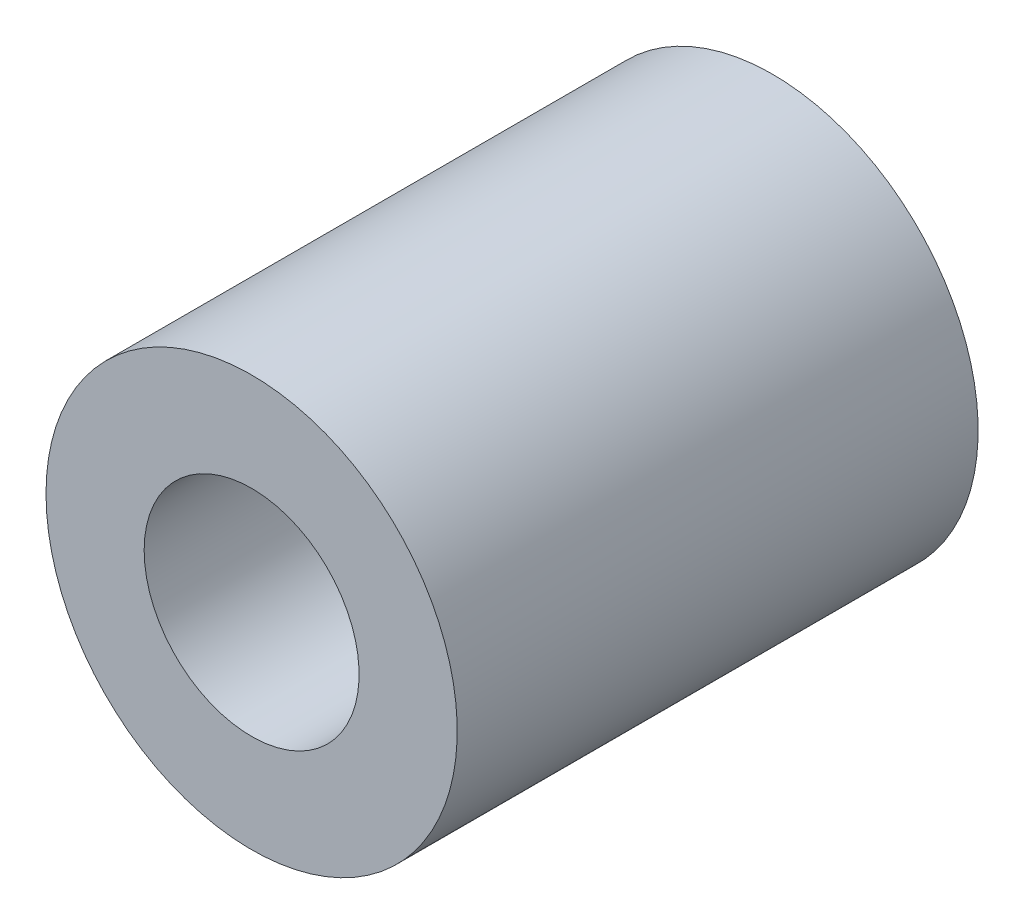
ISO-10303-21;
HEADER;
FILE_DESCRIPTION(('STEP AP214'),'2;1');
FILE_NAME('part.step','',(''),(''),'','','');
FILE_SCHEMA(('AUTOMOTIVE_DESIGN { 1 0 10303 214 1 1 1 1 }'));
ENDSEC;
DATA;
#1=APPLICATION_CONTEXT('core data for automotive mechanical design processes');
#2=APPLICATION_PROTOCOL_DEFINITION('international standard','automotive_design',2000,#1);
#3=PRODUCT_CONTEXT('',#1,'mechanical');
#4=PRODUCT('Part','Part','',(#3));
#5=PRODUCT_RELATED_PRODUCT_CATEGORY('part','',(#4));
#6=PRODUCT_DEFINITION_FORMATION('','',#4);
#7=PRODUCT_DEFINITION_CONTEXT('part definition',#1,'design');
#8=PRODUCT_DEFINITION('design','',#6,#7);
#9=PRODUCT_DEFINITION_SHAPE('','',#8);
#10=(LENGTH_UNIT() NAMED_UNIT(*) SI_UNIT(.MILLI.,.METRE.));
#11=(NAMED_UNIT(*) PLANE_ANGLE_UNIT() SI_UNIT($,.RADIAN.));
#12=(NAMED_UNIT(*) SI_UNIT($,.STERADIAN.) SOLID_ANGLE_UNIT());
#13=UNCERTAINTY_MEASURE_WITH_UNIT(LENGTH_MEASURE(1.E-05),#10,'distance_accuracy_value','');
#14=(GEOMETRIC_REPRESENTATION_CONTEXT(3) GLOBAL_UNCERTAINTY_ASSIGNED_CONTEXT((#13)) GLOBAL_UNIT_ASSIGNED_CONTEXT((#10,
#11,#12)) REPRESENTATION_CONTEXT('',''));
#15=CARTESIAN_POINT('',(0.,0.,0.));
#16=DIRECTION('',(0.,0.,1.));
#17=DIRECTION('',(1.,0.,0.));
#18=AXIS2_PLACEMENT_3D('',#15,#16,#17);
#19=CARTESIAN_POINT('',(0.,0.,6.0325));
#20=DIRECTION('',(0.,0.,1.));
#21=DIRECTION('',(1.,0.,0.));
#22=AXIS2_PLACEMENT_3D('',#19,#20,#21);
#23=PLANE('',#22);
#24=CARTESIAN_POINT('',(0.,0.,6.0325));
#25=DIRECTION('',(0.,0.,1.));
#26=DIRECTION('',(1.,0.,0.));
#27=AXIS2_PLACEMENT_3D('',#24,#25,#26);
#28=CIRCLE('',#27,4.7625);
#29=CARTESIAN_POINT('',(-4.7625,0.,6.0325));
#30=VERTEX_POINT('',#29);
#31=EDGE_CURVE('E10',#30,#30,#28,.T.);
#32=ORIENTED_EDGE('',*,*,#31,.T.);
#33=EDGE_LOOP('',(#32));
#34=FACE_BOUND('',#33,.T.);
#35=CARTESIAN_POINT('',(0.,0.,6.0325));
#36=DIRECTION('',(0.,0.,1.));
#37=DIRECTION('',(1.,0.,0.));
#38=AXIS2_PLACEMENT_3D('',#35,#36,#37);
#39=CIRCLE('',#38,2.4892);
#40=CARTESIAN_POINT('',(-2.4892,0.,6.0325));
#41=VERTEX_POINT('',#40);
#42=EDGE_CURVE('E56',#41,#41,#39,.T.);
#43=ORIENTED_EDGE('',*,*,#42,.F.);
#44=EDGE_LOOP('',(#43));
#45=FACE_BOUND('',#44,.T.);
#46=ADVANCED_FACE('F43',(#34,#45),#23,.T.);
#47=CARTESIAN_POINT('',(0.,0.,-6.0325));
#48=DIRECTION('',(0.,0.,1.));
#49=DIRECTION('',(1.,0.,0.));
#50=AXIS2_PLACEMENT_3D('',#47,#48,#49);
#51=PLANE('',#50);
#52=CARTESIAN_POINT('',(0.,0.,-6.0325));
#53=DIRECTION('',(0.,0.,1.));
#54=DIRECTION('',(1.,0.,0.));
#55=AXIS2_PLACEMENT_3D('',#52,#53,#54);
#56=CIRCLE('',#55,4.7625);
#57=CARTESIAN_POINT('',(-4.7625,0.,-6.0325));
#58=VERTEX_POINT('',#57);
#59=EDGE_CURVE('E47',#58,#58,#56,.T.);
#60=ORIENTED_EDGE('',*,*,#59,.F.);
#61=EDGE_LOOP('',(#60));
#62=FACE_BOUND('',#61,.T.);
#63=CARTESIAN_POINT('',(0.,0.,-6.0325));
#64=DIRECTION('',(0.,0.,1.));
#65=DIRECTION('',(1.,0.,0.));
#66=AXIS2_PLACEMENT_3D('',#63,#64,#65);
#67=CIRCLE('',#66,2.4892);
#68=CARTESIAN_POINT('',(-2.4892,0.,-6.0325));
#69=VERTEX_POINT('',#68);
#70=EDGE_CURVE('E58',#69,#69,#67,.T.);
#71=ORIENTED_EDGE('',*,*,#70,.T.);
#72=EDGE_LOOP('',(#71));
#73=FACE_BOUND('',#72,.T.);
#74=ADVANCED_FACE('F70',(#62,#73),#51,.F.);
#75=CARTESIAN_POINT('',(0.,0.,6.0325));
#76=DIRECTION('',(0.,0.,-1.));
#77=DIRECTION('',(-1.,0.,0.));
#78=AXIS2_PLACEMENT_3D('',#75,#76,#77);
#79=CYLINDRICAL_SURFACE('',#78,4.7625);
#80=CARTESIAN_POINT('',(-4.7625,0.,6.0325));
#81=CARTESIAN_POINT('',(-4.7625,0.,5.90682291666667));
#82=CARTESIAN_POINT('',(-4.7625,0.,5.78114583333333));
#83=CARTESIAN_POINT('',(-4.7625,0.,5.52979166666667));
#84=CARTESIAN_POINT('',(-4.7625,0.,5.40411458333333));
#85=CARTESIAN_POINT('',(-4.7625,0.,5.15276041666667));
#86=CARTESIAN_POINT('',(-4.7625,0.,5.02708333333333));
#87=CARTESIAN_POINT('',(-4.7625,0.,4.77572916666667));
#88=CARTESIAN_POINT('',(-4.7625,0.,4.65005208333333));
#89=CARTESIAN_POINT('',(-4.7625,0.,4.39869791666667));
#90=CARTESIAN_POINT('',(-4.7625,0.,4.27302083333333));
#91=CARTESIAN_POINT('',(-4.7625,0.,4.02166666666667));
#92=CARTESIAN_POINT('',(-4.7625,0.,3.89598958333333));
#93=CARTESIAN_POINT('',(-4.7625,0.,3.64463541666667));
#94=CARTESIAN_POINT('',(-4.7625,0.,3.51895833333333));
#95=CARTESIAN_POINT('',(-4.7625,0.,3.26760416666667));
#96=CARTESIAN_POINT('',(-4.7625,0.,3.14192708333333));
#97=CARTESIAN_POINT('',(-4.7625,0.,2.89057291666667));
#98=CARTESIAN_POINT('',(-4.7625,0.,2.76489583333333));
#99=CARTESIAN_POINT('',(-4.7625,0.,2.51354166666667));
#100=CARTESIAN_POINT('',(-4.7625,0.,2.38786458333333));
#101=CARTESIAN_POINT('',(-4.7625,0.,2.13651041666667));
#102=CARTESIAN_POINT('',(-4.7625,0.,2.01083333333333));
#103=CARTESIAN_POINT('',(-4.7625,0.,1.75947916666667));
#104=CARTESIAN_POINT('',(-4.7625,0.,1.63380208333333));
#105=CARTESIAN_POINT('',(-4.7625,0.,1.38244791666667));
#106=CARTESIAN_POINT('',(-4.7625,0.,1.25677083333333));
#107=CARTESIAN_POINT('',(-4.7625,0.,1.00541666666667));
#108=CARTESIAN_POINT('',(-4.7625,0.,0.879739583333333));
#109=CARTESIAN_POINT('',(-4.7625,0.,0.628385416666666));
#110=CARTESIAN_POINT('',(-4.7625,0.,0.502708333333332));
#111=CARTESIAN_POINT('',(-4.7625,0.,0.251354166666666));
#112=CARTESIAN_POINT('',(-4.7625,0.,0.125677083333332));
#113=CARTESIAN_POINT('',(-4.7625,0.,-0.125677083333334));
#114=CARTESIAN_POINT('',(-4.7625,0.,-0.251354166666667));
#115=CARTESIAN_POINT('',(-4.7625,0.,-0.502708333333334));
#116=CARTESIAN_POINT('',(-4.7625,0.,-0.628385416666668));
#117=CARTESIAN_POINT('',(-4.7625,0.,-0.879739583333334));
#118=CARTESIAN_POINT('',(-4.7625,0.,-1.00541666666667));
#119=CARTESIAN_POINT('',(-4.7625,0.,-1.25677083333333));
#120=CARTESIAN_POINT('',(-4.7625,0.,-1.38244791666667));
#121=CARTESIAN_POINT('',(-4.7625,0.,-1.63380208333333));
#122=CARTESIAN_POINT('',(-4.7625,0.,-1.75947916666667));
#123=CARTESIAN_POINT('',(-4.7625,0.,-2.01083333333333));
#124=CARTESIAN_POINT('',(-4.7625,0.,-2.13651041666667));
#125=CARTESIAN_POINT('',(-4.7625,0.,-2.38786458333333));
#126=CARTESIAN_POINT('',(-4.7625,0.,-2.51354166666667));
#127=CARTESIAN_POINT('',(-4.7625,0.,-2.76489583333333));
#128=CARTESIAN_POINT('',(-4.7625,0.,-2.89057291666667));
#129=CARTESIAN_POINT('',(-4.7625,0.,-3.14192708333333));
#130=CARTESIAN_POINT('',(-4.7625,0.,-3.26760416666667));
#131=CARTESIAN_POINT('',(-4.7625,0.,-3.51895833333333));
#132=CARTESIAN_POINT('',(-4.7625,0.,-3.64463541666667));
#133=CARTESIAN_POINT('',(-4.7625,0.,-3.89598958333333));
#134=CARTESIAN_POINT('',(-4.7625,0.,-4.02166666666667));
#135=CARTESIAN_POINT('',(-4.7625,0.,-4.27302083333333));
#136=CARTESIAN_POINT('',(-4.7625,0.,-4.39869791666667));
#137=CARTESIAN_POINT('',(-4.7625,0.,-4.65005208333333));
#138=CARTESIAN_POINT('',(-4.7625,0.,-4.77572916666667));
#139=CARTESIAN_POINT('',(-4.7625,0.,-5.02708333333333));
#140=CARTESIAN_POINT('',(-4.7625,0.,-5.15276041666667));
#141=CARTESIAN_POINT('',(-4.7625,0.,-5.40411458333334));
#142=CARTESIAN_POINT('',(-4.7625,0.,-5.52979166666667));
#143=CARTESIAN_POINT('',(-4.7625,0.,-5.78114583333334));
#144=CARTESIAN_POINT('',(-4.7625,0.,-5.90682291666667));
#145=CARTESIAN_POINT('',(-4.7625,0.,-6.0325));
#146=B_SPLINE_CURVE_WITH_KNOTS('',3,(#80,#81,#82,#83,#84,#85,#86,#87,#88,#89,#90,#91,#92,#93,
#94,#95,#96,#97,#98,#99,#100,#101,#102,#103,#104,#105,#106,#107,#108,#109,#110,#111,#112,#113,
#114,#115,#116,#117,#118,#119,#120,#121,#122,#123,#124,#125,#126,#127,#128,#129,#130,#131,#132,
#133,#134,#135,#136,#137,#138,#139,#140,#141,#142,#143,#144,#145),.UNSPECIFIED.,.F.,.F.,(4,2,2,
2,2,2,2,2,2,2,2,2,2,2,2,2,2,2,2,2,2,2,2,2,2,2,2,2,2,2,2,2,4),(0.,0.377031250000001,0.7540625,
1.13109375,1.508125,1.88515625,2.2621875,2.63921875,3.01625,3.39328125,3.7703125,4.14734375,
4.524375,4.90140625,5.2784375,5.65546875,6.0325,6.40953125,6.7865625,7.16359375,7.540625,
7.91765625,8.2946875,8.67171875,9.04875,9.42578125,9.8028125,10.17984375,10.556875,10.93390625,
11.3109375,11.68796875,12.065),.UNSPECIFIED.);
#147=EDGE_CURVE('BSEAM45',#30,#58,#146,.T.);
#148=ORIENTED_EDGE('',*,*,#31,.F.);
#149=ORIENTED_EDGE('',*,*,#59,.T.);
#150=ORIENTED_EDGE('',*,*,#147,.T.);
#151=ORIENTED_EDGE('',*,*,#147,.F.);
#152=EDGE_LOOP('',(#148,#150,#149,#151));
#153=FACE_BOUND('',#152,.T.);
#154=ADVANCED_FACE('F45',(#153),#79,.T.);
#155=CARTESIAN_POINT('',(0.,0.,6.0325));
#156=DIRECTION('',(0.,0.,-1.));
#157=DIRECTION('',(-1.,0.,0.));
#158=AXIS2_PLACEMENT_3D('',#155,#156,#157);
#159=CYLINDRICAL_SURFACE('',#158,2.4892);
#160=CARTESIAN_POINT('',(-2.4892,0.,6.0325));
#161=CARTESIAN_POINT('',(-2.4892,0.,5.90682291666667));
#162=CARTESIAN_POINT('',(-2.4892,0.,5.78114583333333));
#163=CARTESIAN_POINT('',(-2.4892,0.,5.52979166666667));
#164=CARTESIAN_POINT('',(-2.4892,0.,5.40411458333333));
#165=CARTESIAN_POINT('',(-2.4892,0.,5.15276041666667));
#166=CARTESIAN_POINT('',(-2.4892,0.,5.02708333333333));
#167=CARTESIAN_POINT('',(-2.4892,0.,4.77572916666667));
#168=CARTESIAN_POINT('',(-2.4892,0.,4.65005208333333));
#169=CARTESIAN_POINT('',(-2.4892,0.,4.39869791666667));
#170=CARTESIAN_POINT('',(-2.4892,0.,4.27302083333333));
#171=CARTESIAN_POINT('',(-2.4892,0.,4.02166666666667));
#172=CARTESIAN_POINT('',(-2.4892,0.,3.89598958333333));
#173=CARTESIAN_POINT('',(-2.4892,0.,3.64463541666667));
#174=CARTESIAN_POINT('',(-2.4892,0.,3.51895833333333));
#175=CARTESIAN_POINT('',(-2.4892,0.,3.26760416666667));
#176=CARTESIAN_POINT('',(-2.4892,0.,3.14192708333333));
#177=CARTESIAN_POINT('',(-2.4892,0.,2.89057291666667));
#178=CARTESIAN_POINT('',(-2.4892,0.,2.76489583333333));
#179=CARTESIAN_POINT('',(-2.4892,0.,2.51354166666667));
#180=CARTESIAN_POINT('',(-2.4892,0.,2.38786458333333));
#181=CARTESIAN_POINT('',(-2.4892,0.,2.13651041666667));
#182=CARTESIAN_POINT('',(-2.4892,0.,2.01083333333333));
#183=CARTESIAN_POINT('',(-2.4892,0.,1.75947916666667));
#184=CARTESIAN_POINT('',(-2.4892,0.,1.63380208333333));
#185=CARTESIAN_POINT('',(-2.4892,0.,1.38244791666667));
#186=CARTESIAN_POINT('',(-2.4892,0.,1.25677083333333));
#187=CARTESIAN_POINT('',(-2.4892,0.,1.00541666666667));
#188=CARTESIAN_POINT('',(-2.4892,0.,0.879739583333333));
#189=CARTESIAN_POINT('',(-2.4892,0.,0.628385416666666));
#190=CARTESIAN_POINT('',(-2.4892,0.,0.502708333333332));
#191=CARTESIAN_POINT('',(-2.4892,0.,0.251354166666666));
#192=CARTESIAN_POINT('',(-2.4892,0.,0.125677083333332));
#193=CARTESIAN_POINT('',(-2.4892,0.,-0.125677083333334));
#194=CARTESIAN_POINT('',(-2.4892,0.,-0.251354166666667));
#195=CARTESIAN_POINT('',(-2.4892,0.,-0.502708333333334));
#196=CARTESIAN_POINT('',(-2.4892,0.,-0.628385416666668));
#197=CARTESIAN_POINT('',(-2.4892,0.,-0.879739583333334));
#198=CARTESIAN_POINT('',(-2.4892,0.,-1.00541666666667));
#199=CARTESIAN_POINT('',(-2.4892,0.,-1.25677083333333));
#200=CARTESIAN_POINT('',(-2.4892,0.,-1.38244791666667));
#201=CARTESIAN_POINT('',(-2.4892,0.,-1.63380208333333));
#202=CARTESIAN_POINT('',(-2.4892,0.,-1.75947916666667));
#203=CARTESIAN_POINT('',(-2.4892,0.,-2.01083333333333));
#204=CARTESIAN_POINT('',(-2.4892,0.,-2.13651041666667));
#205=CARTESIAN_POINT('',(-2.4892,0.,-2.38786458333333));
#206=CARTESIAN_POINT('',(-2.4892,0.,-2.51354166666667));
#207=CARTESIAN_POINT('',(-2.4892,0.,-2.76489583333333));
#208=CARTESIAN_POINT('',(-2.4892,0.,-2.89057291666667));
#209=CARTESIAN_POINT('',(-2.4892,0.,-3.14192708333333));
#210=CARTESIAN_POINT('',(-2.4892,0.,-3.26760416666667));
#211=CARTESIAN_POINT('',(-2.4892,0.,-3.51895833333333));
#212=CARTESIAN_POINT('',(-2.4892,0.,-3.64463541666667));
#213=CARTESIAN_POINT('',(-2.4892,0.,-3.89598958333333));
#214=CARTESIAN_POINT('',(-2.4892,0.,-4.02166666666667));
#215=CARTESIAN_POINT('',(-2.4892,0.,-4.27302083333333));
#216=CARTESIAN_POINT('',(-2.4892,0.,-4.39869791666667));
#217=CARTESIAN_POINT('',(-2.4892,0.,-4.65005208333333));
#218=CARTESIAN_POINT('',(-2.4892,0.,-4.77572916666667));
#219=CARTESIAN_POINT('',(-2.4892,0.,-5.02708333333333));
#220=CARTESIAN_POINT('',(-2.4892,0.,-5.15276041666667));
#221=CARTESIAN_POINT('',(-2.4892,0.,-5.40411458333334));
#222=CARTESIAN_POINT('',(-2.4892,0.,-5.52979166666667));
#223=CARTESIAN_POINT('',(-2.4892,0.,-5.78114583333334));
#224=CARTESIAN_POINT('',(-2.4892,0.,-5.90682291666667));
#225=CARTESIAN_POINT('',(-2.4892,0.,-6.0325));
#226=B_SPLINE_CURVE_WITH_KNOTS('',3,(#160,#161,#162,#163,#164,#165,#166,#167,#168,#169,#170,
#171,#172,#173,#174,#175,#176,#177,#178,#179,#180,#181,#182,#183,#184,#185,#186,#187,#188,#189,
#190,#191,#192,#193,#194,#195,#196,#197,#198,#199,#200,#201,#202,#203,#204,#205,#206,#207,#208,
#209,#210,#211,#212,#213,#214,#215,#216,#217,#218,#219,#220,#221,#222,#223,#224,#225),
.UNSPECIFIED.,.F.,.F.,(4,2,2,2,2,2,2,2,2,2,2,2,2,2,2,2,2,2,2,2,2,2,2,2,2,2,2,2,2,2,2,2,4),(0.,
0.377031250000001,0.7540625,1.13109375,1.508125,1.88515625,2.2621875,2.63921875,3.01625,
3.39328125,3.7703125,4.14734375,4.524375,4.90140625,5.2784375,5.65546875,6.0325,6.40953125,
6.7865625,7.16359375,7.540625,7.91765625,8.2946875,8.67171875,9.04875,9.42578125,9.8028125,
10.17984375,10.556875,10.93390625,11.3109375,11.68796875,12.065),.UNSPECIFIED.);
#227=EDGE_CURVE('BSEAM66',#41,#69,#226,.T.);
#228=ORIENTED_EDGE('',*,*,#42,.T.);
#229=ORIENTED_EDGE('',*,*,#70,.F.);
#230=ORIENTED_EDGE('',*,*,#227,.T.);
#231=ORIENTED_EDGE('',*,*,#227,.F.);
#232=EDGE_LOOP('',(#228,#230,#229,#231));
#233=FACE_BOUND('',#232,.T.);
#234=ADVANCED_FACE('F66',(#233),#159,.F.);
#235=CLOSED_SHELL('',(#46,#74,#154,#234));
#236=MANIFOLD_SOLID_BREP('B2',#235);
#237=ADVANCED_BREP_SHAPE_REPRESENTATION('',(#18,#236),#14);
#238=SHAPE_DEFINITION_REPRESENTATION(#9,#237);
ENDSEC;
END-ISO-10303-21;
